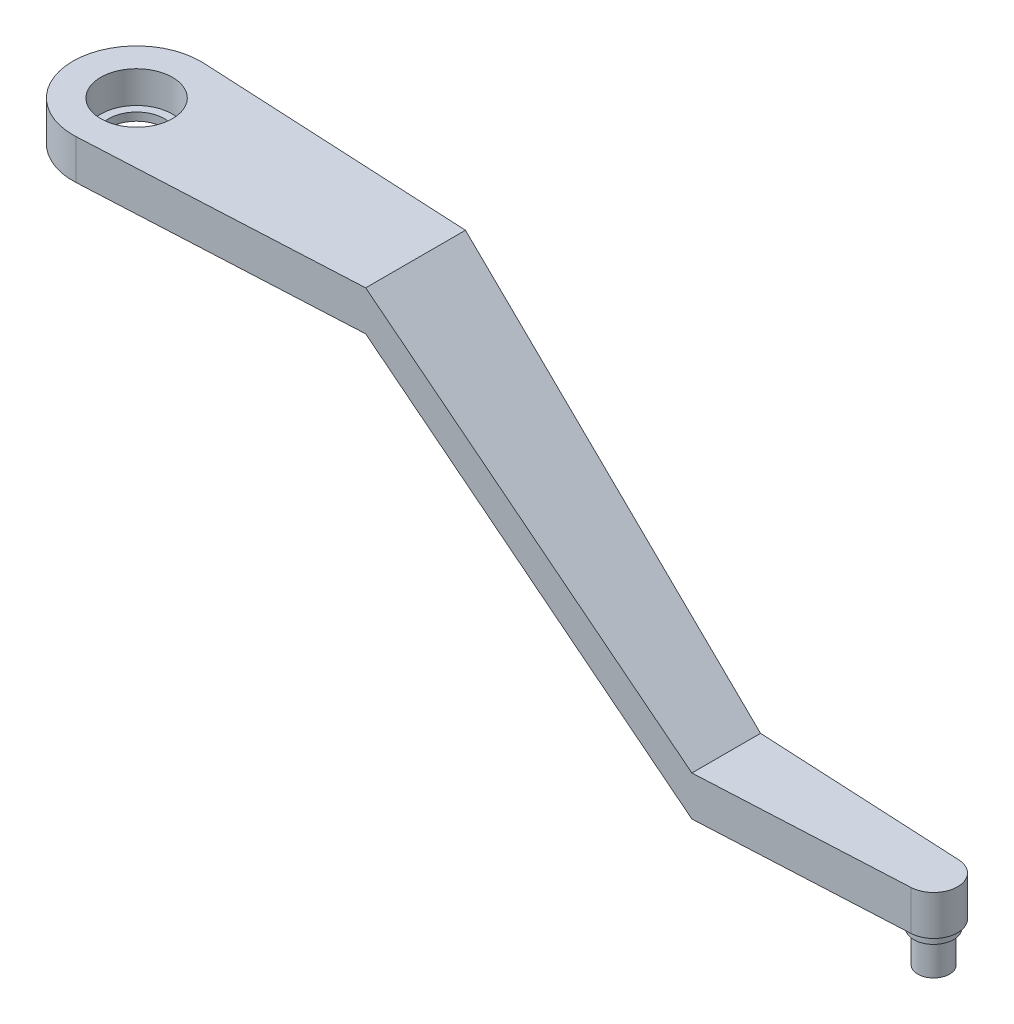
ISO-10303-21;
HEADER;
FILE_DESCRIPTION(('STEP AP214'),'2;1');
FILE_NAME('part.step','',(''),(''),'','','');
FILE_SCHEMA(('AUTOMOTIVE_DESIGN { 1 0 10303 214 1 1 1 1 }'));
ENDSEC;
DATA;
#1=APPLICATION_CONTEXT('core data for automotive mechanical design processes');
#2=APPLICATION_PROTOCOL_DEFINITION('international standard','automotive_design',2000,#1);
#3=PRODUCT_CONTEXT('',#1,'mechanical');
#4=PRODUCT('Part','Part','',(#3));
#5=PRODUCT_RELATED_PRODUCT_CATEGORY('part','',(#4));
#6=PRODUCT_DEFINITION_FORMATION('','',#4);
#7=PRODUCT_DEFINITION_CONTEXT('part definition',#1,'design');
#8=PRODUCT_DEFINITION('design','',#6,#7);
#9=PRODUCT_DEFINITION_SHAPE('','',#8);
#10=(LENGTH_UNIT() NAMED_UNIT(*) SI_UNIT(.MILLI.,.METRE.));
#11=(NAMED_UNIT(*) PLANE_ANGLE_UNIT() SI_UNIT($,.RADIAN.));
#12=(NAMED_UNIT(*) SI_UNIT($,.STERADIAN.) SOLID_ANGLE_UNIT());
#13=UNCERTAINTY_MEASURE_WITH_UNIT(LENGTH_MEASURE(1.E-05),#10,'distance_accuracy_value','');
#14=(GEOMETRIC_REPRESENTATION_CONTEXT(3) GLOBAL_UNCERTAINTY_ASSIGNED_CONTEXT((#13)) GLOBAL_UNIT_ASSIGNED_CONTEXT((#10,
#11,#12)) REPRESENTATION_CONTEXT('',''));
#15=CARTESIAN_POINT('',(0.,0.,0.));
#16=DIRECTION('',(0.,0.,1.));
#17=DIRECTION('',(1.,0.,0.));
#18=AXIS2_PLACEMENT_3D('',#15,#16,#17);
#19=CARTESIAN_POINT('',(8.,-4.99999999999999,16.));
#20=DIRECTION('',(0.,1.,0.));
#21=DIRECTION('',(0.,0.,1.));
#22=AXIS2_PLACEMENT_3D('',#19,#20,#21);
#23=PLANE('',#22);
#24=CARTESIAN_POINT('',(8.,-5.,8.));
#25=DIRECTION('',(0.,1.,0.));
#26=DIRECTION('',(0.,0.,1.));
#27=AXIS2_PLACEMENT_3D('',#24,#25,#26);
#28=CIRCLE('',#27,3.5);
#29=CARTESIAN_POINT('',(8.,-5.,11.5));
#30=VERTEX_POINT('',#29);
#31=EDGE_CURVE('E271',#30,#30,#28,.T.);
#32=ORIENTED_EDGE('',*,*,#31,.T.);
#33=EDGE_LOOP('',(#32));
#34=FACE_BOUND('',#33,.T.);
#35=DIRECTION('',(0.998750338523025,0.,-0.0499776079874067));
#36=VECTOR('',#35,1.);
#37=CARTESIAN_POINT('',(8.00049924817723,-4.99999999999999,16.0099769538017));
#38=LINE('',#37,#36);
#39=CARTESIAN_POINT('',(8.38862406016289,-4.99999999999999,15.9905551333973));
#40=VERTEX_POINT('',#39);
#41=CARTESIAN_POINT('',(43.,-4.99999999999999,14.2585969934041));
#42=VERTEX_POINT('',#41);
#43=EDGE_CURVE('E219',#40,#42,#38,.T.);
#44=ORIENTED_EDGE('',*,*,#43,.F.);
#45=CARTESIAN_POINT('',(8.,-4.99999999999999,8.));
#46=DIRECTION('',(0.,1.,0.));
#47=DIRECTION('',(0.,0.,1.));
#48=AXIS2_PLACEMENT_3D('',#45,#46,#47);
#49=CIRCLE('',#48,8.);
#50=CARTESIAN_POINT('',(8.38862406016289,-4.99999999999999,0.00944486660266197));
#51=VERTEX_POINT('',#50);
#52=EDGE_CURVE('E229',#51,#40,#49,.T.);
#53=ORIENTED_EDGE('',*,*,#52,.F.);
#54=DIRECTION('',(0.998750338523025,0.,0.0499776079874066));
#55=VECTOR('',#54,1.);
#56=CARTESIAN_POINT('',(8.79914169451312,-4.99999999999999,0.0299872270005698));
#57=LINE('',#56,#55);
#58=CARTESIAN_POINT('',(43.,-4.99999999999999,1.74140300659588));
#59=VERTEX_POINT('',#58);
#60=EDGE_CURVE('E209',#51,#59,#57,.T.);
#61=ORIENTED_EDGE('',*,*,#60,.T.);
#62=DIRECTION('',(0.,0.,-1.));
#63=VECTOR('',#62,1.);
#64=CARTESIAN_POINT('',(43.,-4.99999999999999,16.));
#65=LINE('',#64,#63);
#66=EDGE_CURVE('E195',#42,#59,#65,.T.);
#67=ORIENTED_EDGE('',*,*,#66,.F.);
#68=EDGE_LOOP('',(#44,#53,#61,#67));
#69=FACE_BOUND('',#68,.T.);
#70=ADVANCED_FACE('F34',(#34,#69),#23,.F.);
#71=CARTESIAN_POINT('',(8.,0.,16.));
#72=DIRECTION('',(0.,-1.,0.));
#73=DIRECTION('',(0.,0.,-1.));
#74=AXIS2_PLACEMENT_3D('',#71,#72,#73);
#75=PLANE('',#74);
#76=CARTESIAN_POINT('',(8.,0.,8.));
#77=DIRECTION('',(0.,1.,0.));
#78=DIRECTION('',(0.,0.,1.));
#79=AXIS2_PLACEMENT_3D('',#76,#77,#78);
#80=CIRCLE('',#79,4.5);
#81=CARTESIAN_POINT('',(8.,0.,12.5));
#82=VERTEX_POINT('',#81);
#83=EDGE_CURVE('E273',#82,#82,#80,.T.);
#84=ORIENTED_EDGE('',*,*,#83,.F.);
#85=EDGE_LOOP('',(#84));
#86=FACE_BOUND('',#85,.T.);
#87=CARTESIAN_POINT('',(8.38850948720961,0.,0.));
#88=DIRECTION('',(-1.,0.,0.));
#89=VECTOR('',#88,1.);
#90=LINE('',#87,#89);
#91=CARTESIAN_POINT('',(8.38856538336459,4.3898533511998E-06,0.00230244905557394));
#92=VERTEX_POINT('',#91);
#93=CARTESIAN_POINT('',(8.,0.,0.));
#94=VERTEX_POINT('',#93);
#95=EDGE_CURVE('E112',#92,#94,#90,.T.);
#96=ORIENTED_EDGE('',*,*,#95,.T.);
#97=CARTESIAN_POINT('',(8.,0.,8.));
#98=DIRECTION('',(0.,1.,0.));
#99=DIRECTION('',(0.,0.,1.));
#100=AXIS2_PLACEMENT_3D('',#97,#98,#99);
#101=CIRCLE('',#100,8.);
#102=CARTESIAN_POINT('',(8.,0.,16.));
#103=VERTEX_POINT('',#102);
#104=EDGE_CURVE('E104',#94,#103,#101,.T.);
#105=ORIENTED_EDGE('',*,*,#104,.T.);
#106=CARTESIAN_POINT('',(8.,0.,8.));
#107=DIRECTION('',(0.,-1.,0.));
#108=DIRECTION('',(0.0485780075203607,0.,0.998819391674667));
#109=AXIS2_PLACEMENT_3D('',#106,#107,#108);
#110=CIRCLE('',#109,8.);
#111=CARTESIAN_POINT('',(8.38859172377134,2.97174815233398E-06,15.996630491652));
#112=VERTEX_POINT('',#111);
#113=EDGE_CURVE('E108',#112,#103,#110,.T.);
#114=ORIENTED_EDGE('',*,*,#113,.F.);
#115=DIRECTION('',(-0.998750338523025,0.,0.0499776079874067));
#116=VECTOR('',#115,1.);
#117=CARTESIAN_POINT('',(8.00049924817722,0.,16.0099769538017));
#118=LINE('',#117,#116);
#119=CARTESIAN_POINT('',(43.,0.,14.2585969934041));
#120=VERTEX_POINT('',#119);
#121=EDGE_CURVE('E191',#120,#112,#118,.T.);
#122=ORIENTED_EDGE('',*,*,#121,.F.);
#123=DIRECTION('',(0.,0.,-1.));
#124=VECTOR('',#123,1.);
#125=CARTESIAN_POINT('',(43.,0.,16.));
#126=LINE('',#125,#124);
#127=CARTESIAN_POINT('',(43.,0.,1.74140300659588));
#128=VERTEX_POINT('',#127);
#129=EDGE_CURVE('E204',#120,#128,#126,.T.);
#130=ORIENTED_EDGE('',*,*,#129,.T.);
#131=DIRECTION('',(-0.998750338523025,0.,-0.0499776079874066));
#132=VECTOR('',#131,1.);
#133=CARTESIAN_POINT('',(8.79914169451312,0.,0.0299872270005698));
#134=LINE('',#133,#132);
#135=EDGE_CURVE('E187',#128,#92,#134,.T.);
#136=ORIENTED_EDGE('',*,*,#135,.T.);
#137=EDGE_LOOP('',(#96,#105,#114,#122,#130,#136));
#138=FACE_BOUND('',#137,.T.);
#139=ADVANCED_FACE('F106',(#86,#138),#75,.F.);
#140=CARTESIAN_POINT('',(43.,-4.99999999999999,16.));
#141=DIRECTION('',(0.659585797889047,0.751629280445533,0.));
#142=DIRECTION('',(-0.751629280445533,0.659585797889047,0.));
#143=AXIS2_PLACEMENT_3D('',#140,#141,#142);
#144=PLANE('',#143);
#145=ORIENTED_EDGE('',*,*,#66,.T.);
#146=DIRECTION('',(0.75109820325342,-0.659119755675666,0.0375850601640417));
#147=VECTOR('',#146,1.);
#148=CARTESIAN_POINT('',(43.4025212077425,-5.3532290171276,1.76154522467705));
#149=LINE('',#148,#147);
#150=CARTESIAN_POINT('',(81.9725210480674,-39.2,3.69159346370416));
#151=VERTEX_POINT('',#150);
#152=EDGE_CURVE('E49',#59,#151,#149,.T.);
#153=ORIENTED_EDGE('',*,*,#152,.T.);
#154=DIRECTION('',(0.,0.,-1.));
#155=VECTOR('',#154,1.);
#156=CARTESIAN_POINT('',(81.9725210480674,-39.2,16.));
#157=LINE('',#156,#155);
#158=CARTESIAN_POINT('',(81.9725210480674,-39.2,12.3084065362958));
#159=VERTEX_POINT('',#158);
#160=EDGE_CURVE('E198',#159,#151,#157,.T.);
#161=ORIENTED_EDGE('',*,*,#160,.F.);
#162=DIRECTION('',(0.75109820325342,-0.659119755675666,-0.0375850601640417));
#163=VECTOR('',#162,1.);
#164=CARTESIAN_POINT('',(42.9508400692084,-4.95686012636954,14.2610569632835));
#165=LINE('',#164,#163);
#166=EDGE_CURVE('E221',#42,#159,#165,.T.);
#167=ORIENTED_EDGE('',*,*,#166,.F.);
#168=EDGE_LOOP('',(#145,#153,#161,#167));
#169=FACE_BOUND('',#168,.T.);
#170=ADVANCED_FACE('F171',(#169),#144,.F.);
#171=CARTESIAN_POINT('',(81.9725210480674,-34.2,16.));
#172=DIRECTION('',(-0.659585797889047,-0.751629280445533,0.));
#173=DIRECTION('',(0.751629280445533,-0.659585797889047,0.));
#174=AXIS2_PLACEMENT_3D('',#171,#172,#173);
#175=PLANE('',#174);
#176=DIRECTION('',(0.,0.,-1.));
#177=VECTOR('',#176,1.);
#178=CARTESIAN_POINT('',(81.9725210480674,-34.2,16.));
#179=LINE('',#178,#177);
#180=CARTESIAN_POINT('',(81.9725210480674,-34.2,12.3084065362958));
#181=VERTEX_POINT('',#180);
#182=CARTESIAN_POINT('',(81.9725210480674,-34.2,3.69159346370416));
#183=VERTEX_POINT('',#182);
#184=EDGE_CURVE('E201',#181,#183,#179,.T.);
#185=ORIENTED_EDGE('',*,*,#184,.T.);
#186=DIRECTION('',(-0.75109820325342,0.659119755675666,-0.0375850601640417));
#187=VECTOR('',#186,1.);
#188=CARTESIAN_POINT('',(82.3199882404334,-34.5049168403619,3.70898077108093));
#189=LINE('',#188,#187);
#190=EDGE_CURVE('E216',#183,#128,#189,.T.);
#191=ORIENTED_EDGE('',*,*,#190,.T.);
#192=ORIENTED_EDGE('',*,*,#129,.F.);
#193=DIRECTION('',(-0.75109820325342,0.659119755675666,0.0375850601640417));
#194=VECTOR('',#193,1.);
#195=CARTESIAN_POINT('',(81.8683071018992,-34.1085479496039,12.3136214168796));
#196=LINE('',#195,#194);
#197=EDGE_CURVE('E227',#181,#120,#196,.T.);
#198=ORIENTED_EDGE('',*,*,#197,.F.);
#199=EDGE_LOOP('',(#185,#191,#192,#198));
#200=FACE_BOUND('',#199,.T.);
#201=ADVANCED_FACE('F174',(#200),#175,.F.);
#202=CARTESIAN_POINT('',(81.9725210480674,-39.2,16.));
#203=DIRECTION('',(0.,1.,0.));
#204=DIRECTION('',(0.,0.,1.));
#205=AXIS2_PLACEMENT_3D('',#202,#203,#204);
#206=PLANE('',#205);
#207=CARTESIAN_POINT('',(108.,-39.2,8.));
#208=DIRECTION('',(0.,1.,0.));
#209=DIRECTION('',(0.,0.,1.));
#210=AXIS2_PLACEMENT_3D('',#207,#208,#209);
#211=CIRCLE('',#210,2.5);
#212=CARTESIAN_POINT('',(108.,-39.2,10.5));
#213=VERTEX_POINT('',#212);
#214=EDGE_CURVE('E37',#213,#213,#211,.F.);
#215=ORIENTED_EDGE('',*,*,#214,.F.);
#216=EDGE_LOOP('',(#215));
#217=FACE_BOUND('',#216,.T.);
#218=ORIENTED_EDGE('',*,*,#160,.T.);
#219=DIRECTION('',(0.998750338523025,0.,0.0499776079874066));
#220=VECTOR('',#219,1.);
#221=CARTESIAN_POINT('',(82.5868970422327,-39.2,3.72233692521695));
#222=LINE('',#221,#220);
#223=CARTESIAN_POINT('',(108.150044341331,-39.2,5.00152042619877));
#224=VERTEX_POINT('',#223);
#225=EDGE_CURVE('E54',#151,#224,#222,.T.);
#226=ORIENTED_EDGE('',*,*,#225,.T.);
#227=CARTESIAN_POINT('',(108.,-39.2,8.));
#228=DIRECTION('',(0.,1.,0.));
#229=DIRECTION('',(0.,0.,1.));
#230=AXIS2_PLACEMENT_3D('',#227,#228,#229);
#231=CIRCLE('',#230,3.00223134666012);
#232=CARTESIAN_POINT('',(108.150044341331,-39.2,10.9984795738012));
#233=VERTEX_POINT('',#232);
#234=EDGE_CURVE('E207',#233,#224,#231,.T.);
#235=ORIENTED_EDGE('',*,*,#234,.F.);
#236=DIRECTION('',(0.998750338523025,0.,-0.0499776079874067));
#237=VECTOR('',#236,1.);
#238=CARTESIAN_POINT('',(81.7882545958968,-39.2,12.3176272555853));
#239=LINE('',#238,#237);
#240=EDGE_CURVE('E223',#159,#233,#239,.T.);
#241=ORIENTED_EDGE('',*,*,#240,.F.);
#242=EDGE_LOOP('',(#218,#226,#235,#241));
#243=FACE_BOUND('',#242,.T.);
#244=ADVANCED_FACE('F259',(#217,#243),#206,.F.);
#245=CARTESIAN_POINT('',(116.972521048067,-34.2,16.));
#246=DIRECTION('',(0.,-1.,0.));
#247=DIRECTION('',(0.,0.,-1.));
#248=AXIS2_PLACEMENT_3D('',#245,#246,#247);
#249=PLANE('',#248);
#250=CARTESIAN_POINT('',(108.,-34.2,8.));
#251=DIRECTION('',(0.,-1.,0.));
#252=DIRECTION('',(0.,0.,-1.));
#253=AXIS2_PLACEMENT_3D('',#250,#251,#252);
#254=CIRCLE('',#253,3.00223134666012);
#255=CARTESIAN_POINT('',(108.150044341331,-34.2,5.00152042619877));
#256=VERTEX_POINT('',#255);
#257=CARTESIAN_POINT('',(108.150044341331,-34.2,10.9984795738012));
#258=VERTEX_POINT('',#257);
#259=EDGE_CURVE('E185',#256,#258,#254,.T.);
#260=ORIENTED_EDGE('',*,*,#259,.F.);
#261=DIRECTION('',(-0.998750338523025,0.,-0.0499776079874066));
#262=VECTOR('',#261,1.);
#263=CARTESIAN_POINT('',(117.499475396728,-34.2,5.46936727657672));
#264=LINE('',#263,#262);
#265=EDGE_CURVE('E213',#256,#183,#264,.T.);
#266=ORIENTED_EDGE('',*,*,#265,.T.);
#267=ORIENTED_EDGE('',*,*,#184,.F.);
#268=DIRECTION('',(-0.998750338523025,0.,0.0499776079874067));
#269=VECTOR('',#268,1.);
#270=CARTESIAN_POINT('',(116.700832950392,-34.2,10.5705969042256));
#271=LINE('',#270,#269);
#272=EDGE_CURVE('E225',#258,#181,#271,.T.);
#273=ORIENTED_EDGE('',*,*,#272,.F.);
#274=EDGE_LOOP('',(#260,#266,#267,#273));
#275=FACE_BOUND('',#274,.T.);
#276=ADVANCED_FACE('F248',(#275),#249,.F.);
#277=CARTESIAN_POINT('',(108.,-60.,8.));
#278=DIRECTION('',(0.,1.,0.));
#279=DIRECTION('',(0.,0.,1.));
#280=AXIS2_PLACEMENT_3D('',#277,#278,#279);
#281=CYLINDRICAL_SURFACE('',#280,3.00223134666012);
#282=ORIENTED_EDGE('',*,*,#234,.T.);
#283=DIRECTION('',(0.,1.,0.));
#284=VECTOR('',#283,1.);
#285=CARTESIAN_POINT('',(108.150044341331,-60.,5.00152042619877));
#286=LINE('',#285,#284);
#287=EDGE_CURVE('E234',#224,#256,#286,.T.);
#288=ORIENTED_EDGE('',*,*,#287,.T.);
#289=ORIENTED_EDGE('',*,*,#259,.T.);
#290=DIRECTION('',(0.,1.,0.));
#291=VECTOR('',#290,1.);
#292=CARTESIAN_POINT('',(108.150044341331,-60.,10.9984795738012));
#293=LINE('',#292,#291);
#294=EDGE_CURVE('E232',#233,#258,#293,.T.);
#295=ORIENTED_EDGE('',*,*,#294,.F.);
#296=EDGE_LOOP('',(#282,#288,#289,#295));
#297=FACE_BOUND('',#296,.T.);
#298=ADVANCED_FACE('F173',(#297),#281,.T.);
#299=CARTESIAN_POINT('',(0.0204813385783683,-60.,-0.409298176969663));
#300=DIRECTION('',(-0.0499776079874066,0.,0.998750338523025));
#301=DIRECTION('',(0.998750338523025,0.,0.0499776079874066));
#302=AXIS2_PLACEMENT_3D('',#299,#300,#301);
#303=PLANE('',#302);
#304=DIRECTION('',(0.,1.,0.));
#305=VECTOR('',#304,1.);
#306=CARTESIAN_POINT('',(8.38862406016289,-60.,0.00944486660266203));
#307=LINE('',#306,#305);
#308=EDGE_CURVE('E231',#51,#92,#307,.T.);
#309=ORIENTED_EDGE('',*,*,#308,.T.);
#310=ORIENTED_EDGE('',*,*,#135,.F.);
#311=ORIENTED_EDGE('',*,*,#190,.F.);
#312=ORIENTED_EDGE('',*,*,#265,.F.);
#313=ORIENTED_EDGE('',*,*,#287,.F.);
#314=ORIENTED_EDGE('',*,*,#225,.F.);
#315=ORIENTED_EDGE('',*,*,#152,.F.);
#316=ORIENTED_EDGE('',*,*,#60,.F.);
#317=EDGE_LOOP('',(#309,#310,#311,#312,#313,#314,#315,#316));
#318=FACE_BOUND('',#317,.T.);
#319=ADVANCED_FACE('F143',(#318),#303,.F.);
#320=CARTESIAN_POINT('',(0.819123784914264,-60.,16.3693339961674));
#321=DIRECTION('',(0.0499776079874066,0.,0.998750338523025));
#322=DIRECTION('',(0.998750338523025,0.,-0.0499776079874067));
#323=AXIS2_PLACEMENT_3D('',#320,#321,#322);
#324=PLANE('',#323);
#325=ORIENTED_EDGE('',*,*,#43,.T.);
#326=ORIENTED_EDGE('',*,*,#166,.T.);
#327=ORIENTED_EDGE('',*,*,#240,.T.);
#328=ORIENTED_EDGE('',*,*,#294,.T.);
#329=ORIENTED_EDGE('',*,*,#272,.T.);
#330=ORIENTED_EDGE('',*,*,#197,.T.);
#331=ORIENTED_EDGE('',*,*,#121,.T.);
#332=DIRECTION('',(0.,1.,0.));
#333=VECTOR('',#332,1.);
#334=CARTESIAN_POINT('',(8.38862406016289,-60.,15.9905551333973));
#335=LINE('',#334,#333);
#336=EDGE_CURVE('E121',#40,#112,#335,.T.);
#337=ORIENTED_EDGE('',*,*,#336,.F.);
#338=EDGE_LOOP('',(#325,#326,#327,#328,#329,#330,#331,#337));
#339=FACE_BOUND('',#338,.T.);
#340=ADVANCED_FACE('F142',(#339),#324,.T.);
#341=CARTESIAN_POINT('',(8.,-60.,8.));
#342=DIRECTION('',(0.,1.,0.));
#343=DIRECTION('',(0.,0.,1.));
#344=AXIS2_PLACEMENT_3D('',#341,#342,#343);
#345=CYLINDRICAL_SURFACE('',#344,8.);
#346=ORIENTED_EDGE('',*,*,#52,.T.);
#347=ORIENTED_EDGE('',*,*,#336,.T.);
#348=ORIENTED_EDGE('',*,*,#113,.T.);
#349=ORIENTED_EDGE('',*,*,#104,.F.);
#350=ORIENTED_EDGE('',*,*,#95,.F.);
#351=ORIENTED_EDGE('',*,*,#308,.F.);
#352=EDGE_LOOP('',(#346,#347,#348,#349,#350,#351));
#353=FACE_BOUND('',#352,.T.);
#354=ADVANCED_FACE('F119',(#353),#345,.T.);
#355=CARTESIAN_POINT('',(8.,-4.,8.));
#356=DIRECTION('',(0.,1.,0.));
#357=DIRECTION('',(0.,0.,1.));
#358=AXIS2_PLACEMENT_3D('',#355,#356,#357);
#359=CYLINDRICAL_SURFACE('',#358,4.5);
#360=CARTESIAN_POINT('',(8.,-4.,8.));
#361=DIRECTION('',(0.,1.,0.));
#362=DIRECTION('',(0.,0.,1.));
#363=AXIS2_PLACEMENT_3D('',#360,#361,#362);
#364=CIRCLE('',#363,4.5);
#365=CARTESIAN_POINT('',(8.,-4.,12.5));
#366=VERTEX_POINT('',#365);
#367=EDGE_CURVE('E115',#366,#366,#364,.T.);
#368=ORIENTED_EDGE('',*,*,#367,.F.);
#369=EDGE_LOOP('',(#368));
#370=FACE_BOUND('',#369,.T.);
#371=ORIENTED_EDGE('',*,*,#83,.T.);
#372=EDGE_LOOP('',(#371));
#373=FACE_BOUND('',#372,.T.);
#374=ADVANCED_FACE('F141',(#370,#373),#359,.F.);
#375=CARTESIAN_POINT('',(8.,-4.,8.));
#376=DIRECTION('',(0.,1.,0.));
#377=DIRECTION('',(0.,0.,1.));
#378=AXIS2_PLACEMENT_3D('',#375,#376,#377);
#379=PLANE('',#378);
#380=CARTESIAN_POINT('',(8.,-4.,8.));
#381=DIRECTION('',(0.,1.,0.));
#382=DIRECTION('',(0.,0.,1.));
#383=AXIS2_PLACEMENT_3D('',#380,#381,#382);
#384=CIRCLE('',#383,3.5);
#385=CARTESIAN_POINT('',(8.,-4.,11.5));
#386=VERTEX_POINT('',#385);
#387=EDGE_CURVE('E274',#386,#386,#384,.T.);
#388=ORIENTED_EDGE('',*,*,#387,.F.);
#389=EDGE_LOOP('',(#388));
#390=FACE_BOUND('',#389,.T.);
#391=ORIENTED_EDGE('',*,*,#367,.T.);
#392=EDGE_LOOP('',(#391));
#393=FACE_BOUND('',#392,.T.);
#394=ADVANCED_FACE('F285',(#390,#393),#379,.T.);
#395=CARTESIAN_POINT('',(8.,-5.,8.));
#396=DIRECTION('',(0.,1.,0.));
#397=DIRECTION('',(0.,0.,1.));
#398=AXIS2_PLACEMENT_3D('',#395,#396,#397);
#399=CYLINDRICAL_SURFACE('',#398,3.5);
#400=ORIENTED_EDGE('',*,*,#31,.F.);
#401=EDGE_LOOP('',(#400));
#402=FACE_BOUND('',#401,.T.);
#403=ORIENTED_EDGE('',*,*,#387,.T.);
#404=EDGE_LOOP('',(#403));
#405=FACE_BOUND('',#404,.T.);
#406=ADVANCED_FACE('F293',(#402,#405),#399,.F.);
#407=CARTESIAN_POINT('',(108.,-40.2,8.));
#408=DIRECTION('',(0.,1.,0.));
#409=DIRECTION('',(0.,0.,1.));
#410=AXIS2_PLACEMENT_3D('',#407,#408,#409);
#411=CYLINDRICAL_SURFACE('',#410,2.5);
#412=CARTESIAN_POINT('',(108.,-40.2,8.));
#413=DIRECTION('',(0.,-1.,0.));
#414=DIRECTION('',(0.,0.,-1.));
#415=AXIS2_PLACEMENT_3D('',#412,#413,#414);
#416=CIRCLE('',#415,2.5);
#417=CARTESIAN_POINT('',(108.,-40.2,5.50000000000001));
#418=VERTEX_POINT('',#417);
#419=EDGE_CURVE('E278',#418,#418,#416,.T.);
#420=ORIENTED_EDGE('',*,*,#419,.F.);
#421=EDGE_LOOP('',(#420));
#422=FACE_BOUND('',#421,.T.);
#423=ORIENTED_EDGE('',*,*,#214,.T.);
#424=EDGE_LOOP('',(#423));
#425=FACE_BOUND('',#424,.T.);
#426=ADVANCED_FACE('F299',(#422,#425),#411,.T.);
#427=CARTESIAN_POINT('',(108.,-40.2,8.));
#428=DIRECTION('',(0.,-1.,0.));
#429=DIRECTION('',(0.,0.,-1.));
#430=AXIS2_PLACEMENT_3D('',#427,#428,#429);
#431=PLANE('',#430);
#432=CARTESIAN_POINT('',(108.,-40.2,8.));
#433=DIRECTION('',(0.,-1.,0.));
#434=DIRECTION('',(0.,0.,-1.));
#435=AXIS2_PLACEMENT_3D('',#432,#433,#434);
#436=CIRCLE('',#435,2.);
#437=CARTESIAN_POINT('',(108.,-40.2,6.));
#438=VERTEX_POINT('',#437);
#439=EDGE_CURVE('E11',#438,#438,#436,.T.);
#440=ORIENTED_EDGE('',*,*,#439,.F.);
#441=EDGE_LOOP('',(#440));
#442=FACE_BOUND('',#441,.T.);
#443=ORIENTED_EDGE('',*,*,#419,.T.);
#444=EDGE_LOOP('',(#443));
#445=FACE_BOUND('',#444,.T.);
#446=ADVANCED_FACE('F302',(#442,#445),#431,.T.);
#447=CARTESIAN_POINT('',(108.,-44.2,8.));
#448=DIRECTION('',(0.,1.,0.));
#449=DIRECTION('',(0.,0.,1.));
#450=AXIS2_PLACEMENT_3D('',#447,#448,#449);
#451=CYLINDRICAL_SURFACE('',#450,2.);
#452=CARTESIAN_POINT('',(108.,-44.2,8.));
#453=DIRECTION('',(0.,-1.,0.));
#454=DIRECTION('',(0.,0.,-1.));
#455=AXIS2_PLACEMENT_3D('',#452,#453,#454);
#456=CIRCLE('',#455,2.);
#457=CARTESIAN_POINT('',(108.,-44.2,6.));
#458=VERTEX_POINT('',#457);
#459=EDGE_CURVE('E318',#458,#458,#456,.T.);
#460=ORIENTED_EDGE('',*,*,#459,.F.);
#461=EDGE_LOOP('',(#460));
#462=FACE_BOUND('',#461,.T.);
#463=ORIENTED_EDGE('',*,*,#439,.T.);
#464=EDGE_LOOP('',(#463));
#465=FACE_BOUND('',#464,.T.);
#466=ADVANCED_FACE('F306',(#462,#465),#451,.T.);
#467=CARTESIAN_POINT('',(108.,-44.2,8.));
#468=DIRECTION('',(0.,-1.,0.));
#469=DIRECTION('',(0.,0.,-1.));
#470=AXIS2_PLACEMENT_3D('',#467,#468,#469);
#471=PLANE('',#470);
#472=ORIENTED_EDGE('',*,*,#459,.T.);
#473=EDGE_LOOP('',(#472));
#474=FACE_BOUND('',#473,.T.);
#475=ADVANCED_FACE('F310',(#474),#471,.T.);
#476=CLOSED_SHELL('',(#70,#139,#170,#201,#244,#276,#298,#319,#340,#354,#374,#394,#406,#426,#446,
#466,#475));
#477=MANIFOLD_SOLID_BREP('B2',#476);
#478=ADVANCED_BREP_SHAPE_REPRESENTATION('',(#18,#477),#14);
#479=SHAPE_DEFINITION_REPRESENTATION(#9,#478);
ENDSEC;
END-ISO-10303-21;
